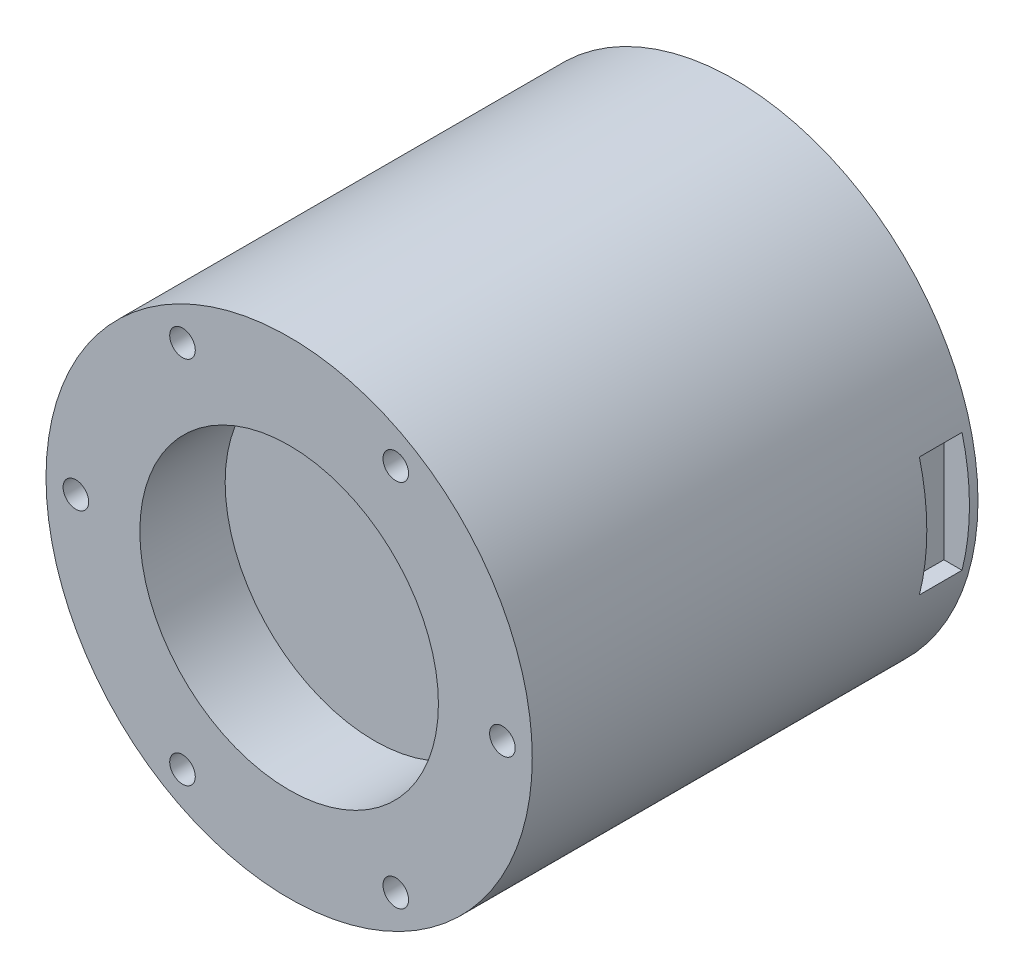
ISO-10303-21;
HEADER;
FILE_DESCRIPTION(('STEP AP214'),'2;1');
FILE_NAME('part.step','',(''),(''),'','','');
FILE_SCHEMA(('AUTOMOTIVE_DESIGN { 1 0 10303 214 1 1 1 1 }'));
ENDSEC;
DATA;
#1=APPLICATION_CONTEXT('core data for automotive mechanical design processes');
#2=APPLICATION_PROTOCOL_DEFINITION('international standard','automotive_design',2000,#1);
#3=PRODUCT_CONTEXT('',#1,'mechanical');
#4=PRODUCT('Part','Part','',(#3));
#5=PRODUCT_RELATED_PRODUCT_CATEGORY('part','',(#4));
#6=PRODUCT_DEFINITION_FORMATION('','',#4);
#7=PRODUCT_DEFINITION_CONTEXT('part definition',#1,'design');
#8=PRODUCT_DEFINITION('design','',#6,#7);
#9=PRODUCT_DEFINITION_SHAPE('','',#8);
#10=(LENGTH_UNIT() NAMED_UNIT(*) SI_UNIT(.MILLI.,.METRE.));
#11=(NAMED_UNIT(*) PLANE_ANGLE_UNIT() SI_UNIT($,.RADIAN.));
#12=(NAMED_UNIT(*) SI_UNIT($,.STERADIAN.) SOLID_ANGLE_UNIT());
#13=UNCERTAINTY_MEASURE_WITH_UNIT(LENGTH_MEASURE(1.E-05),#10,'distance_accuracy_value','');
#14=(GEOMETRIC_REPRESENTATION_CONTEXT(3) GLOBAL_UNCERTAINTY_ASSIGNED_CONTEXT((#13)) GLOBAL_UNIT_ASSIGNED_CONTEXT((#10,
#11,#12)) REPRESENTATION_CONTEXT('',''));
#15=CARTESIAN_POINT('',(0.,0.,0.));
#16=DIRECTION('',(0.,0.,1.));
#17=DIRECTION('',(1.,0.,0.));
#18=AXIS2_PLACEMENT_3D('',#15,#16,#17);
#19=CARTESIAN_POINT('',(0.,0.,52.25));
#20=DIRECTION('',(0.,0.,-1.));
#21=DIRECTION('',(-1.,0.,0.));
#22=AXIS2_PLACEMENT_3D('',#19,#20,#21);
#23=CYLINDRICAL_SURFACE('',#22,28.5);
#24=CARTESIAN_POINT('',(0.,0.,6.));
#25=DIRECTION('',(0.,0.,-1.));
#26=DIRECTION('',(-1.,0.,0.));
#27=AXIS2_PLACEMENT_3D('',#24,#25,#26);
#28=CIRCLE('',#27,28.5);
#29=CARTESIAN_POINT('',(-27.6269795670826,-7.,6.));
#30=VERTEX_POINT('',#29);
#31=CARTESIAN_POINT('',(-27.6269795670826,7.,6.));
#32=VERTEX_POINT('',#31);
#33=EDGE_CURVE('E195',#30,#32,#28,.T.);
#34=ORIENTED_EDGE('',*,*,#33,.F.);
#35=DIRECTION('',(0.,0.,-1.));
#36=VECTOR('',#35,1.);
#37=CARTESIAN_POINT('',(-27.6269795670826,-7.,6.));
#38=LINE('',#37,#36);
#39=CARTESIAN_POINT('',(-27.6269795670826,-7.,1.));
#40=VERTEX_POINT('',#39);
#41=EDGE_CURVE('E208',#30,#40,#38,.T.);
#42=ORIENTED_EDGE('',*,*,#41,.T.);
#43=CARTESIAN_POINT('',(0.,0.,1.));
#44=DIRECTION('',(0.,0.,-1.));
#45=DIRECTION('',(-1.,0.,0.));
#46=AXIS2_PLACEMENT_3D('',#43,#44,#45);
#47=CIRCLE('',#46,28.5);
#48=CARTESIAN_POINT('',(-27.6269795670826,7.,1.));
#49=VERTEX_POINT('',#48);
#50=EDGE_CURVE('E213',#40,#49,#47,.T.);
#51=ORIENTED_EDGE('',*,*,#50,.T.);
#52=DIRECTION('',(0.,0.,-1.));
#53=VECTOR('',#52,1.);
#54=CARTESIAN_POINT('',(-27.6269795670826,7.,6.));
#55=LINE('',#54,#53);
#56=EDGE_CURVE('E230',#32,#49,#55,.T.);
#57=ORIENTED_EDGE('',*,*,#56,.F.);
#58=EDGE_LOOP('',(#34,#42,#51,#57));
#59=FACE_BOUND('',#58,.T.);
#60=CARTESIAN_POINT('',(0.,0.,0.));
#61=DIRECTION('',(0.,0.,1.));
#62=DIRECTION('',(1.,0.,0.));
#63=AXIS2_PLACEMENT_3D('',#60,#61,#62);
#64=CIRCLE('',#63,28.5);
#65=CARTESIAN_POINT('',(28.5,0.,0.));
#66=VERTEX_POINT('',#65);
#67=EDGE_CURVE('E47',#66,#66,#64,.T.);
#68=ORIENTED_EDGE('',*,*,#67,.T.);
#69=EDGE_LOOP('',(#68));
#70=FACE_BOUND('',#69,.T.);
#71=CARTESIAN_POINT('',(0.,0.,52.25));
#72=DIRECTION('',(0.,0.,1.));
#73=DIRECTION('',(1.,0.,0.));
#74=AXIS2_PLACEMENT_3D('',#71,#72,#73);
#75=CIRCLE('',#74,28.5);
#76=CARTESIAN_POINT('',(28.5,0.,52.25));
#77=VERTEX_POINT('',#76);
#78=EDGE_CURVE('E11',#77,#77,#75,.T.);
#79=ORIENTED_EDGE('',*,*,#78,.F.);
#80=EDGE_LOOP('',(#79));
#81=FACE_BOUND('',#80,.T.);
#82=CARTESIAN_POINT('',(0.,0.,6.));
#83=DIRECTION('',(0.,0.,-1.));
#84=DIRECTION('',(-1.,0.,0.));
#85=AXIS2_PLACEMENT_3D('',#82,#83,#84);
#86=CIRCLE('',#85,28.5);
#87=CARTESIAN_POINT('',(27.6269795670826,7.,6.));
#88=VERTEX_POINT('',#87);
#89=CARTESIAN_POINT('',(27.6269795670826,-7.,6.));
#90=VERTEX_POINT('',#89);
#91=EDGE_CURVE('E243',#88,#90,#86,.T.);
#92=ORIENTED_EDGE('',*,*,#91,.F.);
#93=DIRECTION('',(0.,0.,-1.));
#94=VECTOR('',#93,1.);
#95=CARTESIAN_POINT('',(27.6269795670826,7.,6.));
#96=LINE('',#95,#94);
#97=CARTESIAN_POINT('',(27.6269795670826,7.,1.));
#98=VERTEX_POINT('',#97);
#99=EDGE_CURVE('E270',#88,#98,#96,.T.);
#100=ORIENTED_EDGE('',*,*,#99,.T.);
#101=CARTESIAN_POINT('',(0.,0.,1.));
#102=DIRECTION('',(0.,0.,-1.));
#103=DIRECTION('',(-1.,0.,0.));
#104=AXIS2_PLACEMENT_3D('',#101,#102,#103);
#105=CIRCLE('',#104,28.5);
#106=CARTESIAN_POINT('',(27.6269795670826,-7.,1.));
#107=VERTEX_POINT('',#106);
#108=EDGE_CURVE('E257',#98,#107,#105,.T.);
#109=ORIENTED_EDGE('',*,*,#108,.T.);
#110=DIRECTION('',(0.,0.,-1.));
#111=VECTOR('',#110,1.);
#112=CARTESIAN_POINT('',(27.6269795670826,-7.,6.));
#113=LINE('',#112,#111);
#114=EDGE_CURVE('E266',#90,#107,#113,.T.);
#115=ORIENTED_EDGE('',*,*,#114,.F.);
#116=EDGE_LOOP('',(#92,#100,#109,#115));
#117=FACE_BOUND('',#116,.T.);
#118=CARTESIAN_POINT('',(0.,0.,9.));
#119=DIRECTION('',(0.,0.,-1.));
#120=DIRECTION('',(-1.,0.,0.));
#121=AXIS2_PLACEMENT_3D('',#118,#119,#120);
#122=CIRCLE('',#121,28.5);
#123=CARTESIAN_POINT('',(3.99999999999999,-28.2179021190449,9.));
#124=VERTEX_POINT('',#123);
#125=CARTESIAN_POINT('',(-3.99999999999999,-28.2179021190449,9.));
#126=VERTEX_POINT('',#125);
#127=EDGE_CURVE('E148',#124,#126,#122,.T.);
#128=ORIENTED_EDGE('',*,*,#127,.F.);
#129=DIRECTION('',(0.,0.,-1.));
#130=VECTOR('',#129,1.);
#131=CARTESIAN_POINT('',(3.99999999999999,-28.2179021190449,9.));
#132=LINE('',#131,#130);
#133=CARTESIAN_POINT('',(3.99999999999999,-28.2179021190449,1.));
#134=VERTEX_POINT('',#133);
#135=EDGE_CURVE('E143',#124,#134,#132,.T.);
#136=ORIENTED_EDGE('',*,*,#135,.T.);
#137=CARTESIAN_POINT('',(0.,0.,1.));
#138=DIRECTION('',(0.,0.,-1.));
#139=DIRECTION('',(-1.,0.,0.));
#140=AXIS2_PLACEMENT_3D('',#137,#138,#139);
#141=CIRCLE('',#140,28.5);
#142=CARTESIAN_POINT('',(-3.99999999999999,-28.2179021190449,1.));
#143=VERTEX_POINT('',#142);
#144=EDGE_CURVE('E164',#134,#143,#141,.T.);
#145=ORIENTED_EDGE('',*,*,#144,.T.);
#146=DIRECTION('',(0.,0.,-1.));
#147=VECTOR('',#146,1.);
#148=CARTESIAN_POINT('',(-3.99999999999999,-28.2179021190449,9.));
#149=LINE('',#148,#147);
#150=EDGE_CURVE('E187',#126,#143,#149,.T.);
#151=ORIENTED_EDGE('',*,*,#150,.F.);
#152=EDGE_LOOP('',(#128,#136,#145,#151));
#153=FACE_BOUND('',#152,.T.);
#154=ADVANCED_FACE('F44',(#59,#70,#81,#117,#153),#23,.T.);
#155=CARTESIAN_POINT('',(0.,0.,52.25));
#156=DIRECTION('',(0.,0.,1.));
#157=DIRECTION('',(1.,0.,0.));
#158=AXIS2_PLACEMENT_3D('',#155,#156,#157);
#159=PLANE('',#158);
#160=CARTESIAN_POINT('',(0.,0.,52.25));
#161=DIRECTION('',(0.,0.,1.));
#162=DIRECTION('',(1.,0.,0.));
#163=AXIS2_PLACEMENT_3D('',#160,#161,#162);
#164=CIRCLE('',#163,17.5);
#165=CARTESIAN_POINT('',(17.5,0.,52.25));
#166=VERTEX_POINT('',#165);
#167=EDGE_CURVE('E226',#166,#166,#164,.T.);
#168=ORIENTED_EDGE('',*,*,#167,.F.);
#169=EDGE_LOOP('',(#168));
#170=FACE_BOUND('',#169,.T.);
#171=CARTESIAN_POINT('',(12.5000000000003,-21.6506350946108,52.25));
#172=DIRECTION('',(0.,0.,1.));
#173=DIRECTION('',(0.50000000000001,-0.866025403784433,0.));
#174=AXIS2_PLACEMENT_3D('',#171,#172,#173);
#175=CIRCLE('',#174,1.5);
#176=CARTESIAN_POINT('',(13.2500000000003,-22.9496732002875,52.25));
#177=VERTEX_POINT('',#176);
#178=EDGE_CURVE('E281',#177,#177,#175,.T.);
#179=ORIENTED_EDGE('',*,*,#178,.F.);
#180=EDGE_LOOP('',(#179));
#181=FACE_BOUND('',#180,.T.);
#182=CARTESIAN_POINT('',(-12.4999999999998,-21.6506350946111,52.25));
#183=DIRECTION('',(0.,0.,1.));
#184=DIRECTION('',(-0.499999999999992,-0.866025403784443,0.));
#185=AXIS2_PLACEMENT_3D('',#182,#183,#184);
#186=CIRCLE('',#185,1.5);
#187=CARTESIAN_POINT('',(-13.2499999999998,-22.9496732002878,52.25));
#188=VERTEX_POINT('',#187);
#189=EDGE_CURVE('E306',#188,#188,#186,.T.);
#190=ORIENTED_EDGE('',*,*,#189,.F.);
#191=EDGE_LOOP('',(#190));
#192=FACE_BOUND('',#191,.T.);
#193=CARTESIAN_POINT('',(-25.,0.,52.25));
#194=DIRECTION('',(0.,0.,1.));
#195=DIRECTION('',(-1.,0.,0.));
#196=AXIS2_PLACEMENT_3D('',#193,#194,#195);
#197=CIRCLE('',#196,1.5);
#198=CARTESIAN_POINT('',(-26.5,0.,52.25));
#199=VERTEX_POINT('',#198);
#200=EDGE_CURVE('E298',#199,#199,#197,.T.);
#201=ORIENTED_EDGE('',*,*,#200,.F.);
#202=EDGE_LOOP('',(#201));
#203=FACE_BOUND('',#202,.T.);
#204=CARTESIAN_POINT('',(-12.5000000000001,21.6506350946109,52.25));
#205=DIRECTION('',(0.,0.,1.));
#206=DIRECTION('',(-0.500000000000004,0.866025403784436,0.));
#207=AXIS2_PLACEMENT_3D('',#204,#205,#206);
#208=CIRCLE('',#207,1.5);
#209=CARTESIAN_POINT('',(-13.2500000000001,22.9496732002876,52.25));
#210=VERTEX_POINT('',#209);
#211=EDGE_CURVE('E290',#210,#210,#208,.T.);
#212=ORIENTED_EDGE('',*,*,#211,.F.);
#213=EDGE_LOOP('',(#212));
#214=FACE_BOUND('',#213,.T.);
#215=CARTESIAN_POINT('',(12.5,21.650635094611,52.25));
#216=DIRECTION('',(0.,0.,1.));
#217=DIRECTION('',(0.499999999999998,0.86602540378444,0.));
#218=AXIS2_PLACEMENT_3D('',#215,#216,#217);
#219=CIRCLE('',#218,1.5);
#220=CARTESIAN_POINT('',(13.2499999999999,22.9496732002877,52.25));
#221=VERTEX_POINT('',#220);
#222=EDGE_CURVE('E289',#221,#221,#219,.T.);
#223=ORIENTED_EDGE('',*,*,#222,.F.);
#224=EDGE_LOOP('',(#223));
#225=FACE_BOUND('',#224,.T.);
#226=CARTESIAN_POINT('',(25.,0.,52.25));
#227=DIRECTION('',(0.,0.,1.));
#228=DIRECTION('',(1.,0.,0.));
#229=AXIS2_PLACEMENT_3D('',#226,#227,#228);
#230=CIRCLE('',#229,1.5);
#231=CARTESIAN_POINT('',(26.5,0.,52.25));
#232=VERTEX_POINT('',#231);
#233=EDGE_CURVE('E321',#232,#232,#230,.T.);
#234=ORIENTED_EDGE('',*,*,#233,.F.);
#235=EDGE_LOOP('',(#234));
#236=FACE_BOUND('',#235,.T.);
#237=ORIENTED_EDGE('',*,*,#78,.T.);
#238=EDGE_LOOP('',(#237));
#239=FACE_BOUND('',#238,.T.);
#240=ADVANCED_FACE('F335',(#170,#181,#192,#203,#214,#225,#236,#239),#159,.T.);
#241=CARTESIAN_POINT('',(0.,0.,0.));
#242=DIRECTION('',(0.,0.,1.));
#243=DIRECTION('',(1.,0.,0.));
#244=AXIS2_PLACEMENT_3D('',#241,#242,#243);
#245=PLANE('',#244);
#246=CARTESIAN_POINT('',(-13.4350288425444,-13.4350288425444,0.));
#247=DIRECTION('',(0.,0.,-1.));
#248=DIRECTION('',(0.,-1.,0.));
#249=AXIS2_PLACEMENT_3D('',#246,#247,#248);
#250=CIRCLE('',#249,1.5);
#251=CARTESIAN_POINT('',(-13.4350288425444,-14.9350288425444,0.));
#252=VERTEX_POINT('',#251);
#253=EDGE_CURVE('E471',#252,#252,#250,.T.);
#254=ORIENTED_EDGE('',*,*,#253,.F.);
#255=EDGE_LOOP('',(#254));
#256=FACE_BOUND('',#255,.T.);
#257=CARTESIAN_POINT('',(13.4350288425444,-13.4350288425444,0.));
#258=DIRECTION('',(0.,0.,-1.));
#259=DIRECTION('',(1.,0.,0.));
#260=AXIS2_PLACEMENT_3D('',#257,#258,#259);
#261=CIRCLE('',#260,1.5);
#262=CARTESIAN_POINT('',(14.9350288425444,-13.4350288425444,0.));
#263=VERTEX_POINT('',#262);
#264=EDGE_CURVE('E475',#263,#263,#261,.T.);
#265=ORIENTED_EDGE('',*,*,#264,.F.);
#266=EDGE_LOOP('',(#265));
#267=FACE_BOUND('',#266,.T.);
#268=CARTESIAN_POINT('',(13.4350288425443,13.4350288425445,0.));
#269=DIRECTION('',(0.,0.,-1.));
#270=DIRECTION('',(0.,1.,0.));
#271=AXIS2_PLACEMENT_3D('',#268,#269,#270);
#272=CIRCLE('',#271,1.5);
#273=CARTESIAN_POINT('',(13.4350288425443,14.9350288425445,0.));
#274=VERTEX_POINT('',#273);
#275=EDGE_CURVE('E479',#274,#274,#272,.T.);
#276=ORIENTED_EDGE('',*,*,#275,.F.);
#277=EDGE_LOOP('',(#276));
#278=FACE_BOUND('',#277,.T.);
#279=CARTESIAN_POINT('',(-13.4350288425444,13.4350288425444,0.));
#280=DIRECTION('',(0.,0.,-1.));
#281=DIRECTION('',(-1.,0.,0.));
#282=AXIS2_PLACEMENT_3D('',#279,#280,#281);
#283=CIRCLE('',#282,1.5);
#284=CARTESIAN_POINT('',(-14.9350288425444,13.4350288425444,0.));
#285=VERTEX_POINT('',#284);
#286=EDGE_CURVE('E167',#285,#285,#283,.T.);
#287=ORIENTED_EDGE('',*,*,#286,.F.);
#288=EDGE_LOOP('',(#287));
#289=FACE_BOUND('',#288,.T.);
#290=ORIENTED_EDGE('',*,*,#67,.F.);
#291=EDGE_LOOP('',(#290));
#292=FACE_BOUND('',#291,.T.);
#293=ADVANCED_FACE('F338',(#256,#267,#278,#289,#292),#245,.F.);
#294=CARTESIAN_POINT('',(25.,0.,47.25));
#295=DIRECTION('',(0.,0.,1.));
#296=DIRECTION('',(1.,0.,0.));
#297=AXIS2_PLACEMENT_3D('',#294,#295,#296);
#298=CYLINDRICAL_SURFACE('',#297,1.5);
#299=CARTESIAN_POINT('',(25.,0.,47.25));
#300=DIRECTION('',(0.,0.,1.));
#301=DIRECTION('',(1.,0.,0.));
#302=AXIS2_PLACEMENT_3D('',#299,#300,#301);
#303=CIRCLE('',#302,1.5);
#304=CARTESIAN_POINT('',(26.5,0.,47.25));
#305=VERTEX_POINT('',#304);
#306=EDGE_CURVE('E325',#305,#305,#303,.T.);
#307=ORIENTED_EDGE('',*,*,#306,.F.);
#308=EDGE_LOOP('',(#307));
#309=FACE_BOUND('',#308,.T.);
#310=ORIENTED_EDGE('',*,*,#233,.T.);
#311=EDGE_LOOP('',(#310));
#312=FACE_BOUND('',#311,.T.);
#313=ADVANCED_FACE('F333',(#309,#312),#298,.F.);
#314=CARTESIAN_POINT('',(25.,0.,47.25));
#315=DIRECTION('',(0.,0.,1.));
#316=DIRECTION('',(1.,0.,0.));
#317=AXIS2_PLACEMENT_3D('',#314,#315,#316);
#318=PLANE('',#317);
#319=ORIENTED_EDGE('',*,*,#306,.T.);
#320=EDGE_LOOP('',(#319));
#321=FACE_BOUND('',#320,.T.);
#322=ADVANCED_FACE('F457',(#321),#318,.T.);
#323=CARTESIAN_POINT('',(12.5,21.650635094611,47.25));
#324=DIRECTION('',(0.,0.,1.));
#325=DIRECTION('',(1.,0.,0.));
#326=AXIS2_PLACEMENT_3D('',#323,#324,#325);
#327=CYLINDRICAL_SURFACE('',#326,1.5);
#328=CARTESIAN_POINT('',(12.5,21.650635094611,47.25));
#329=DIRECTION('',(0.,0.,1.));
#330=DIRECTION('',(0.499999999999998,0.86602540378444,0.));
#331=AXIS2_PLACEMENT_3D('',#328,#329,#330);
#332=CIRCLE('',#331,1.5);
#333=CARTESIAN_POINT('',(13.2499999999999,22.9496732002877,47.25));
#334=VERTEX_POINT('',#333);
#335=EDGE_CURVE('E317',#334,#334,#332,.T.);
#336=ORIENTED_EDGE('',*,*,#335,.F.);
#337=EDGE_LOOP('',(#336));
#338=FACE_BOUND('',#337,.T.);
#339=ORIENTED_EDGE('',*,*,#222,.T.);
#340=EDGE_LOOP('',(#339));
#341=FACE_BOUND('',#340,.T.);
#342=ADVANCED_FACE('F453',(#338,#341),#327,.F.);
#343=CARTESIAN_POINT('',(12.5,21.650635094611,47.25));
#344=DIRECTION('',(0.,0.,1.));
#345=DIRECTION('',(0.499999999999998,0.86602540378444,0.));
#346=AXIS2_PLACEMENT_3D('',#343,#344,#345);
#347=PLANE('',#346);
#348=ORIENTED_EDGE('',*,*,#335,.T.);
#349=EDGE_LOOP('',(#348));
#350=FACE_BOUND('',#349,.T.);
#351=ADVANCED_FACE('F427',(#350),#347,.T.);
#352=CARTESIAN_POINT('',(-12.5000000000001,21.6506350946109,47.25));
#353=DIRECTION('',(0.,0.,1.));
#354=DIRECTION('',(1.,0.,0.));
#355=AXIS2_PLACEMENT_3D('',#352,#353,#354);
#356=CYLINDRICAL_SURFACE('',#355,1.5);
#357=CARTESIAN_POINT('',(-12.5000000000001,21.6506350946109,47.25));
#358=DIRECTION('',(0.,0.,1.));
#359=DIRECTION('',(-0.500000000000004,0.866025403784436,0.));
#360=AXIS2_PLACEMENT_3D('',#357,#358,#359);
#361=CIRCLE('',#360,1.5);
#362=CARTESIAN_POINT('',(-13.2500000000001,22.9496732002876,47.25));
#363=VERTEX_POINT('',#362);
#364=EDGE_CURVE('E285',#363,#363,#361,.T.);
#365=ORIENTED_EDGE('',*,*,#364,.F.);
#366=EDGE_LOOP('',(#365));
#367=FACE_BOUND('',#366,.T.);
#368=ORIENTED_EDGE('',*,*,#211,.T.);
#369=EDGE_LOOP('',(#368));
#370=FACE_BOUND('',#369,.T.);
#371=ADVANCED_FACE('F423',(#367,#370),#356,.F.);
#372=CARTESIAN_POINT('',(-12.5000000000001,21.6506350946109,47.25));
#373=DIRECTION('',(0.,0.,1.));
#374=DIRECTION('',(-0.500000000000004,0.866025403784436,0.));
#375=AXIS2_PLACEMENT_3D('',#372,#373,#374);
#376=PLANE('',#375);
#377=ORIENTED_EDGE('',*,*,#364,.T.);
#378=EDGE_LOOP('',(#377));
#379=FACE_BOUND('',#378,.T.);
#380=ADVANCED_FACE('F419',(#379),#376,.T.);
#381=CARTESIAN_POINT('',(-25.,0.,47.25));
#382=DIRECTION('',(0.,0.,1.));
#383=DIRECTION('',(1.,0.,0.));
#384=AXIS2_PLACEMENT_3D('',#381,#382,#383);
#385=CYLINDRICAL_SURFACE('',#384,1.5);
#386=CARTESIAN_POINT('',(-25.,0.,47.25));
#387=DIRECTION('',(0.,0.,1.));
#388=DIRECTION('',(-1.,0.,0.));
#389=AXIS2_PLACEMENT_3D('',#386,#387,#388);
#390=CIRCLE('',#389,1.5);
#391=CARTESIAN_POINT('',(-26.5,0.,47.25));
#392=VERTEX_POINT('',#391);
#393=EDGE_CURVE('E294',#392,#392,#390,.T.);
#394=ORIENTED_EDGE('',*,*,#393,.F.);
#395=EDGE_LOOP('',(#394));
#396=FACE_BOUND('',#395,.T.);
#397=ORIENTED_EDGE('',*,*,#200,.T.);
#398=EDGE_LOOP('',(#397));
#399=FACE_BOUND('',#398,.T.);
#400=ADVANCED_FACE('F422',(#396,#399),#385,.F.);
#401=CARTESIAN_POINT('',(-25.,0.,47.25));
#402=DIRECTION('',(0.,0.,1.));
#403=DIRECTION('',(-1.,0.,0.));
#404=AXIS2_PLACEMENT_3D('',#401,#402,#403);
#405=PLANE('',#404);
#406=ORIENTED_EDGE('',*,*,#393,.T.);
#407=EDGE_LOOP('',(#406));
#408=FACE_BOUND('',#407,.T.);
#409=ADVANCED_FACE('F429',(#408),#405,.T.);
#410=CARTESIAN_POINT('',(-12.4999999999998,-21.6506350946111,47.25));
#411=DIRECTION('',(0.,0.,1.));
#412=DIRECTION('',(1.,0.,0.));
#413=AXIS2_PLACEMENT_3D('',#410,#411,#412);
#414=CYLINDRICAL_SURFACE('',#413,1.5);
#415=CARTESIAN_POINT('',(-12.4999999999998,-21.6506350946111,47.25));
#416=DIRECTION('',(0.,0.,1.));
#417=DIRECTION('',(-0.499999999999992,-0.866025403784443,0.));
#418=AXIS2_PLACEMENT_3D('',#415,#416,#417);
#419=CIRCLE('',#418,1.5);
#420=CARTESIAN_POINT('',(-13.2499999999998,-22.9496732002878,47.25));
#421=VERTEX_POINT('',#420);
#422=EDGE_CURVE('E302',#421,#421,#419,.T.);
#423=ORIENTED_EDGE('',*,*,#422,.F.);
#424=EDGE_LOOP('',(#423));
#425=FACE_BOUND('',#424,.T.);
#426=ORIENTED_EDGE('',*,*,#189,.T.);
#427=EDGE_LOOP('',(#426));
#428=FACE_BOUND('',#427,.T.);
#429=ADVANCED_FACE('F432',(#425,#428),#414,.F.);
#430=CARTESIAN_POINT('',(-12.4999999999998,-21.6506350946111,47.25));
#431=DIRECTION('',(0.,0.,1.));
#432=DIRECTION('',(-0.499999999999992,-0.866025403784443,0.));
#433=AXIS2_PLACEMENT_3D('',#430,#431,#432);
#434=PLANE('',#433);
#435=ORIENTED_EDGE('',*,*,#422,.T.);
#436=EDGE_LOOP('',(#435));
#437=FACE_BOUND('',#436,.T.);
#438=ADVANCED_FACE('F437',(#437),#434,.T.);
#439=CARTESIAN_POINT('',(12.5000000000003,-21.6506350946108,47.25));
#440=DIRECTION('',(0.,0.,1.));
#441=DIRECTION('',(1.,0.,0.));
#442=AXIS2_PLACEMENT_3D('',#439,#440,#441);
#443=CYLINDRICAL_SURFACE('',#442,1.5);
#444=CARTESIAN_POINT('',(12.5000000000003,-21.6506350946108,47.25));
#445=DIRECTION('',(0.,0.,1.));
#446=DIRECTION('',(0.50000000000001,-0.866025403784433,0.));
#447=AXIS2_PLACEMENT_3D('',#444,#445,#446);
#448=CIRCLE('',#447,1.5);
#449=CARTESIAN_POINT('',(13.2500000000003,-22.9496732002875,47.25));
#450=VERTEX_POINT('',#449);
#451=EDGE_CURVE('E310',#450,#450,#448,.T.);
#452=ORIENTED_EDGE('',*,*,#451,.F.);
#453=EDGE_LOOP('',(#452));
#454=FACE_BOUND('',#453,.T.);
#455=ORIENTED_EDGE('',*,*,#178,.T.);
#456=EDGE_LOOP('',(#455));
#457=FACE_BOUND('',#456,.T.);
#458=ADVANCED_FACE('F440',(#454,#457),#443,.F.);
#459=CARTESIAN_POINT('',(12.5000000000003,-21.6506350946108,47.25));
#460=DIRECTION('',(0.,0.,1.));
#461=DIRECTION('',(0.50000000000001,-0.866025403784433,0.));
#462=AXIS2_PLACEMENT_3D('',#459,#460,#461);
#463=PLANE('',#462);
#464=ORIENTED_EDGE('',*,*,#451,.T.);
#465=EDGE_LOOP('',(#464));
#466=FACE_BOUND('',#465,.T.);
#467=ADVANCED_FACE('F417',(#466),#463,.T.);
#468=CARTESIAN_POINT('',(0.,0.,42.25));
#469=DIRECTION('',(0.,0.,1.));
#470=DIRECTION('',(1.,0.,0.));
#471=AXIS2_PLACEMENT_3D('',#468,#469,#470);
#472=CYLINDRICAL_SURFACE('',#471,17.5);
#473=CARTESIAN_POINT('',(0.,0.,42.25));
#474=DIRECTION('',(0.,0.,1.));
#475=DIRECTION('',(1.,0.,0.));
#476=AXIS2_PLACEMENT_3D('',#473,#474,#475);
#477=CIRCLE('',#476,17.5);
#478=CARTESIAN_POINT('',(17.5,0.,42.25));
#479=VERTEX_POINT('',#478);
#480=EDGE_CURVE('E277',#479,#479,#477,.T.);
#481=ORIENTED_EDGE('',*,*,#480,.F.);
#482=EDGE_LOOP('',(#481));
#483=FACE_BOUND('',#482,.T.);
#484=ORIENTED_EDGE('',*,*,#167,.T.);
#485=EDGE_LOOP('',(#484));
#486=FACE_BOUND('',#485,.T.);
#487=ADVANCED_FACE('F413',(#483,#486),#472,.F.);
#488=CARTESIAN_POINT('',(0.,0.,42.25));
#489=DIRECTION('',(0.,0.,1.));
#490=DIRECTION('',(1.,0.,0.));
#491=AXIS2_PLACEMENT_3D('',#488,#489,#490);
#492=PLANE('',#491);
#493=ORIENTED_EDGE('',*,*,#480,.T.);
#494=EDGE_LOOP('',(#493));
#495=FACE_BOUND('',#494,.T.);
#496=ADVANCED_FACE('F409',(#495),#492,.T.);
#497=CARTESIAN_POINT('',(25.5,0.,6.));
#498=DIRECTION('',(1.,0.,0.));
#499=DIRECTION('',(0.,0.,-1.));
#500=AXIS2_PLACEMENT_3D('',#497,#498,#499);
#501=PLANE('',#500);
#502=DIRECTION('',(0.,-1.,0.));
#503=VECTOR('',#502,1.);
#504=CARTESIAN_POINT('',(25.5,0.,1.));
#505=LINE('',#504,#503);
#506=CARTESIAN_POINT('',(25.5,7.,1.));
#507=VERTEX_POINT('',#506);
#508=CARTESIAN_POINT('',(25.5,-7.,1.));
#509=VERTEX_POINT('',#508);
#510=EDGE_CURVE('E186',#507,#509,#505,.T.);
#511=ORIENTED_EDGE('',*,*,#510,.F.);
#512=DIRECTION('',(0.,0.,-1.));
#513=VECTOR('',#512,1.);
#514=CARTESIAN_POINT('',(25.5,7.,6.));
#515=LINE('',#514,#513);
#516=CARTESIAN_POINT('',(25.5,7.,6.));
#517=VERTEX_POINT('',#516);
#518=EDGE_CURVE('E250',#517,#507,#515,.T.);
#519=ORIENTED_EDGE('',*,*,#518,.F.);
#520=DIRECTION('',(0.,-1.,0.));
#521=VECTOR('',#520,1.);
#522=CARTESIAN_POINT('',(25.5,0.,6.));
#523=LINE('',#522,#521);
#524=CARTESIAN_POINT('',(25.5,-7.,6.));
#525=VERTEX_POINT('',#524);
#526=EDGE_CURVE('E236',#517,#525,#523,.T.);
#527=ORIENTED_EDGE('',*,*,#526,.T.);
#528=DIRECTION('',(0.,0.,-1.));
#529=VECTOR('',#528,1.);
#530=CARTESIAN_POINT('',(25.5,-7.,6.));
#531=LINE('',#530,#529);
#532=EDGE_CURVE('E214',#525,#509,#531,.T.);
#533=ORIENTED_EDGE('',*,*,#532,.T.);
#534=EDGE_LOOP('',(#511,#519,#527,#533));
#535=FACE_BOUND('',#534,.T.);
#536=ADVANCED_FACE('F402',(#535),#501,.T.);
#537=CARTESIAN_POINT('',(0.,-7.,6.));
#538=DIRECTION('',(0.,-1.,0.));
#539=DIRECTION('',(0.,0.,-1.));
#540=AXIS2_PLACEMENT_3D('',#537,#538,#539);
#541=PLANE('',#540);
#542=DIRECTION('',(-1.,0.,0.));
#543=VECTOR('',#542,1.);
#544=CARTESIAN_POINT('',(0.,-7.,1.));
#545=LINE('',#544,#543);
#546=EDGE_CURVE('E240',#107,#509,#545,.T.);
#547=ORIENTED_EDGE('',*,*,#546,.T.);
#548=ORIENTED_EDGE('',*,*,#532,.F.);
#549=DIRECTION('',(-1.,0.,0.));
#550=VECTOR('',#549,1.);
#551=CARTESIAN_POINT('',(0.,-7.,6.));
#552=LINE('',#551,#550);
#553=EDGE_CURVE('E246',#90,#525,#552,.T.);
#554=ORIENTED_EDGE('',*,*,#553,.F.);
#555=ORIENTED_EDGE('',*,*,#114,.T.);
#556=EDGE_LOOP('',(#547,#548,#554,#555));
#557=FACE_BOUND('',#556,.T.);
#558=ADVANCED_FACE('F399',(#557),#541,.F.);
#559=CARTESIAN_POINT('',(0.,7.,6.));
#560=DIRECTION('',(0.,-1.,0.));
#561=DIRECTION('',(0.,0.,-1.));
#562=AXIS2_PLACEMENT_3D('',#559,#560,#561);
#563=PLANE('',#562);
#564=DIRECTION('',(-1.,0.,0.));
#565=VECTOR('',#564,1.);
#566=CARTESIAN_POINT('',(0.,7.,1.));
#567=LINE('',#566,#565);
#568=EDGE_CURVE('E254',#98,#507,#567,.T.);
#569=ORIENTED_EDGE('',*,*,#568,.F.);
#570=ORIENTED_EDGE('',*,*,#99,.F.);
#571=DIRECTION('',(-1.,0.,0.));
#572=VECTOR('',#571,1.);
#573=CARTESIAN_POINT('',(0.,7.,6.));
#574=LINE('',#573,#572);
#575=EDGE_CURVE('E239',#88,#517,#574,.T.);
#576=ORIENTED_EDGE('',*,*,#575,.T.);
#577=ORIENTED_EDGE('',*,*,#518,.T.);
#578=EDGE_LOOP('',(#569,#570,#576,#577));
#579=FACE_BOUND('',#578,.T.);
#580=ADVANCED_FACE('F394',(#579),#563,.T.);
#581=CARTESIAN_POINT('',(0.,0.,6.));
#582=DIRECTION('',(0.,0.,-1.));
#583=DIRECTION('',(-1.,0.,0.));
#584=AXIS2_PLACEMENT_3D('',#581,#582,#583);
#585=PLANE('',#584);
#586=ORIENTED_EDGE('',*,*,#526,.F.);
#587=ORIENTED_EDGE('',*,*,#575,.F.);
#588=ORIENTED_EDGE('',*,*,#91,.T.);
#589=ORIENTED_EDGE('',*,*,#553,.T.);
#590=EDGE_LOOP('',(#586,#587,#588,#589));
#591=FACE_BOUND('',#590,.T.);
#592=ADVANCED_FACE('F391',(#591),#585,.T.);
#593=CARTESIAN_POINT('',(0.,0.,1.));
#594=DIRECTION('',(0.,0.,-1.));
#595=DIRECTION('',(-1.,0.,0.));
#596=AXIS2_PLACEMENT_3D('',#593,#594,#595);
#597=PLANE('',#596);
#598=ORIENTED_EDGE('',*,*,#510,.T.);
#599=ORIENTED_EDGE('',*,*,#546,.F.);
#600=ORIENTED_EDGE('',*,*,#108,.F.);
#601=ORIENTED_EDGE('',*,*,#568,.T.);
#602=EDGE_LOOP('',(#598,#599,#600,#601));
#603=FACE_BOUND('',#602,.T.);
#604=ADVANCED_FACE('F389',(#603),#597,.F.);
#605=CARTESIAN_POINT('',(0.,-7.,6.));
#606=DIRECTION('',(0.,1.,0.));
#607=DIRECTION('',(0.,0.,1.));
#608=AXIS2_PLACEMENT_3D('',#605,#606,#607);
#609=PLANE('',#608);
#610=DIRECTION('',(1.,0.,0.));
#611=VECTOR('',#610,1.);
#612=CARTESIAN_POINT('',(0.,-7.,1.));
#613=LINE('',#612,#611);
#614=CARTESIAN_POINT('',(-25.5,-7.,1.));
#615=VERTEX_POINT('',#614);
#616=EDGE_CURVE('E209',#40,#615,#613,.T.);
#617=ORIENTED_EDGE('',*,*,#616,.F.);
#618=ORIENTED_EDGE('',*,*,#41,.F.);
#619=DIRECTION('',(1.,0.,0.));
#620=VECTOR('',#619,1.);
#621=CARTESIAN_POINT('',(0.,-7.,6.));
#622=LINE('',#621,#620);
#623=CARTESIAN_POINT('',(-25.5,-7.,6.));
#624=VERTEX_POINT('',#623);
#625=EDGE_CURVE('E192',#30,#624,#622,.T.);
#626=ORIENTED_EDGE('',*,*,#625,.T.);
#627=DIRECTION('',(0.,0.,-1.));
#628=VECTOR('',#627,1.);
#629=CARTESIAN_POINT('',(-25.5,-7.,6.));
#630=LINE('',#629,#628);
#631=EDGE_CURVE('E223',#624,#615,#630,.T.);
#632=ORIENTED_EDGE('',*,*,#631,.T.);
#633=EDGE_LOOP('',(#617,#618,#626,#632));
#634=FACE_BOUND('',#633,.T.);
#635=ADVANCED_FACE('F382',(#634),#609,.T.);
#636=CARTESIAN_POINT('',(-25.5,0.,6.));
#637=DIRECTION('',(1.,0.,0.));
#638=DIRECTION('',(0.,0.,-1.));
#639=AXIS2_PLACEMENT_3D('',#636,#637,#638);
#640=PLANE('',#639);
#641=DIRECTION('',(0.,-1.,0.));
#642=VECTOR('',#641,1.);
#643=CARTESIAN_POINT('',(-25.5,0.,1.));
#644=LINE('',#643,#642);
#645=CARTESIAN_POINT('',(-25.5,7.,1.));
#646=VERTEX_POINT('',#645);
#647=EDGE_CURVE('E196',#646,#615,#644,.T.);
#648=ORIENTED_EDGE('',*,*,#647,.T.);
#649=ORIENTED_EDGE('',*,*,#631,.F.);
#650=DIRECTION('',(0.,-1.,0.));
#651=VECTOR('',#650,1.);
#652=CARTESIAN_POINT('',(-25.5,0.,6.));
#653=LINE('',#652,#651);
#654=CARTESIAN_POINT('',(-25.5,7.,6.));
#655=VERTEX_POINT('',#654);
#656=EDGE_CURVE('E204',#655,#624,#653,.T.);
#657=ORIENTED_EDGE('',*,*,#656,.F.);
#658=DIRECTION('',(0.,0.,-1.));
#659=VECTOR('',#658,1.);
#660=CARTESIAN_POINT('',(-25.5,7.,6.));
#661=LINE('',#660,#659);
#662=EDGE_CURVE('E227',#655,#646,#661,.T.);
#663=ORIENTED_EDGE('',*,*,#662,.T.);
#664=EDGE_LOOP('',(#648,#649,#657,#663));
#665=FACE_BOUND('',#664,.T.);
#666=ADVANCED_FACE('F379',(#665),#640,.F.);
#667=CARTESIAN_POINT('',(0.,7.,6.));
#668=DIRECTION('',(0.,1.,0.));
#669=DIRECTION('',(0.,0.,1.));
#670=AXIS2_PLACEMENT_3D('',#667,#668,#669);
#671=PLANE('',#670);
#672=DIRECTION('',(1.,0.,0.));
#673=VECTOR('',#672,1.);
#674=CARTESIAN_POINT('',(0.,7.,1.));
#675=LINE('',#674,#673);
#676=EDGE_CURVE('E67',#49,#646,#675,.T.);
#677=ORIENTED_EDGE('',*,*,#676,.T.);
#678=ORIENTED_EDGE('',*,*,#662,.F.);
#679=DIRECTION('',(1.,0.,0.));
#680=VECTOR('',#679,1.);
#681=CARTESIAN_POINT('',(0.,7.,6.));
#682=LINE('',#681,#680);
#683=EDGE_CURVE('E200',#32,#655,#682,.T.);
#684=ORIENTED_EDGE('',*,*,#683,.F.);
#685=ORIENTED_EDGE('',*,*,#56,.T.);
#686=EDGE_LOOP('',(#677,#678,#684,#685));
#687=FACE_BOUND('',#686,.T.);
#688=ADVANCED_FACE('F375',(#687),#671,.F.);
#689=CARTESIAN_POINT('',(0.,0.,6.));
#690=DIRECTION('',(0.,0.,-1.));
#691=DIRECTION('',(-1.,0.,0.));
#692=AXIS2_PLACEMENT_3D('',#689,#690,#691);
#693=PLANE('',#692);
#694=ORIENTED_EDGE('',*,*,#625,.F.);
#695=ORIENTED_EDGE('',*,*,#33,.T.);
#696=ORIENTED_EDGE('',*,*,#683,.T.);
#697=ORIENTED_EDGE('',*,*,#656,.T.);
#698=EDGE_LOOP('',(#694,#695,#696,#697));
#699=FACE_BOUND('',#698,.T.);
#700=ADVANCED_FACE('F372',(#699),#693,.T.);
#701=CARTESIAN_POINT('',(0.,0.,1.));
#702=DIRECTION('',(0.,0.,-1.));
#703=DIRECTION('',(-1.,0.,0.));
#704=AXIS2_PLACEMENT_3D('',#701,#702,#703);
#705=PLANE('',#704);
#706=ORIENTED_EDGE('',*,*,#616,.T.);
#707=ORIENTED_EDGE('',*,*,#647,.F.);
#708=ORIENTED_EDGE('',*,*,#676,.F.);
#709=ORIENTED_EDGE('',*,*,#50,.F.);
#710=EDGE_LOOP('',(#706,#707,#708,#709));
#711=FACE_BOUND('',#710,.T.);
#712=ADVANCED_FACE('F371',(#711),#705,.F.);
#713=CARTESIAN_POINT('',(0.,-25.5,9.));
#714=DIRECTION('',(0.,-1.,0.));
#715=DIRECTION('',(0.,0.,-1.));
#716=AXIS2_PLACEMENT_3D('',#713,#714,#715);
#717=PLANE('',#716);
#718=DIRECTION('',(-1.,0.,0.));
#719=VECTOR('',#718,1.);
#720=CARTESIAN_POINT('',(0.,-25.5,1.));
#721=LINE('',#720,#719);
#722=CARTESIAN_POINT('',(3.99999999999999,-25.5,1.));
#723=VERTEX_POINT('',#722);
#724=CARTESIAN_POINT('',(-3.99999999999999,-25.5,1.));
#725=VERTEX_POINT('',#724);
#726=EDGE_CURVE('E154',#723,#725,#721,.T.);
#727=ORIENTED_EDGE('',*,*,#726,.F.);
#728=DIRECTION('',(0.,0.,-1.));
#729=VECTOR('',#728,1.);
#730=CARTESIAN_POINT('',(3.99999999999999,-25.5,9.));
#731=LINE('',#730,#729);
#732=CARTESIAN_POINT('',(3.99999999999999,-25.5,9.));
#733=VERTEX_POINT('',#732);
#734=EDGE_CURVE('E140',#733,#723,#731,.T.);
#735=ORIENTED_EDGE('',*,*,#734,.F.);
#736=DIRECTION('',(-1.,0.,0.));
#737=VECTOR('',#736,1.);
#738=CARTESIAN_POINT('',(0.,-25.5,9.));
#739=LINE('',#738,#737);
#740=CARTESIAN_POINT('',(-3.99999999999999,-25.5,9.));
#741=VERTEX_POINT('',#740);
#742=EDGE_CURVE('E149',#733,#741,#739,.T.);
#743=ORIENTED_EDGE('',*,*,#742,.T.);
#744=DIRECTION('',(0.,0.,-1.));
#745=VECTOR('',#744,1.);
#746=CARTESIAN_POINT('',(-3.99999999999999,-25.5,9.));
#747=LINE('',#746,#745);
#748=EDGE_CURVE('E183',#741,#725,#747,.T.);
#749=ORIENTED_EDGE('',*,*,#748,.T.);
#750=EDGE_LOOP('',(#727,#735,#743,#749));
#751=FACE_BOUND('',#750,.T.);
#752=ADVANCED_FACE('F152',(#751),#717,.T.);
#753=CARTESIAN_POINT('',(-3.99999999999999,0.,9.));
#754=DIRECTION('',(-1.,0.,0.));
#755=DIRECTION('',(0.,0.,1.));
#756=AXIS2_PLACEMENT_3D('',#753,#754,#755);
#757=PLANE('',#756);
#758=DIRECTION('',(0.,1.,0.));
#759=VECTOR('',#758,1.);
#760=CARTESIAN_POINT('',(-3.99999999999999,0.,1.));
#761=LINE('',#760,#759);
#762=EDGE_CURVE('E59',#143,#725,#761,.T.);
#763=ORIENTED_EDGE('',*,*,#762,.T.);
#764=ORIENTED_EDGE('',*,*,#748,.F.);
#765=DIRECTION('',(0.,1.,0.));
#766=VECTOR('',#765,1.);
#767=CARTESIAN_POINT('',(-3.99999999999999,0.,9.));
#768=LINE('',#767,#766);
#769=EDGE_CURVE('E156',#126,#741,#768,.T.);
#770=ORIENTED_EDGE('',*,*,#769,.F.);
#771=ORIENTED_EDGE('',*,*,#150,.T.);
#772=EDGE_LOOP('',(#763,#764,#770,#771));
#773=FACE_BOUND('',#772,.T.);
#774=ADVANCED_FACE('F351',(#773),#757,.F.);
#775=CARTESIAN_POINT('',(3.99999999999999,0.,9.));
#776=DIRECTION('',(-1.,0.,0.));
#777=DIRECTION('',(0.,0.,1.));
#778=AXIS2_PLACEMENT_3D('',#775,#776,#777);
#779=PLANE('',#778);
#780=DIRECTION('',(0.,1.,0.));
#781=VECTOR('',#780,1.);
#782=CARTESIAN_POINT('',(3.99999999999999,0.,1.));
#783=LINE('',#782,#781);
#784=EDGE_CURVE('E176',#134,#723,#783,.T.);
#785=ORIENTED_EDGE('',*,*,#784,.F.);
#786=ORIENTED_EDGE('',*,*,#135,.F.);
#787=DIRECTION('',(0.,1.,0.));
#788=VECTOR('',#787,1.);
#789=CARTESIAN_POINT('',(3.99999999999999,0.,9.));
#790=LINE('',#789,#788);
#791=EDGE_CURVE('E137',#124,#733,#790,.T.);
#792=ORIENTED_EDGE('',*,*,#791,.T.);
#793=ORIENTED_EDGE('',*,*,#734,.T.);
#794=EDGE_LOOP('',(#785,#786,#792,#793));
#795=FACE_BOUND('',#794,.T.);
#796=ADVANCED_FACE('F139',(#795),#779,.T.);
#797=CARTESIAN_POINT('',(0.,0.,9.));
#798=DIRECTION('',(0.,0.,-1.));
#799=DIRECTION('',(-1.,0.,0.));
#800=AXIS2_PLACEMENT_3D('',#797,#798,#799);
#801=PLANE('',#800);
#802=ORIENTED_EDGE('',*,*,#742,.F.);
#803=ORIENTED_EDGE('',*,*,#791,.F.);
#804=ORIENTED_EDGE('',*,*,#127,.T.);
#805=ORIENTED_EDGE('',*,*,#769,.T.);
#806=EDGE_LOOP('',(#802,#803,#804,#805));
#807=FACE_BOUND('',#806,.T.);
#808=ADVANCED_FACE('F159',(#807),#801,.T.);
#809=CARTESIAN_POINT('',(0.,0.,1.));
#810=DIRECTION('',(0.,0.,-1.));
#811=DIRECTION('',(-1.,0.,0.));
#812=AXIS2_PLACEMENT_3D('',#809,#810,#811);
#813=PLANE('',#812);
#814=ORIENTED_EDGE('',*,*,#726,.T.);
#815=ORIENTED_EDGE('',*,*,#762,.F.);
#816=ORIENTED_EDGE('',*,*,#144,.F.);
#817=ORIENTED_EDGE('',*,*,#784,.T.);
#818=EDGE_LOOP('',(#814,#815,#816,#817));
#819=FACE_BOUND('',#818,.T.);
#820=ADVANCED_FACE('F352',(#819),#813,.F.);
#821=CARTESIAN_POINT('',(-13.4350288425444,13.4350288425444,4.));
#822=DIRECTION('',(0.,0.,-1.));
#823=DIRECTION('',(-1.,0.,0.));
#824=AXIS2_PLACEMENT_3D('',#821,#822,#823);
#825=CYLINDRICAL_SURFACE('',#824,1.5);
#826=CARTESIAN_POINT('',(-13.4350288425444,13.4350288425444,4.));
#827=DIRECTION('',(0.,0.,-1.));
#828=DIRECTION('',(-1.,0.,0.));
#829=AXIS2_PLACEMENT_3D('',#826,#827,#828);
#830=CIRCLE('',#829,1.5);
#831=CARTESIAN_POINT('',(-14.9350288425444,13.4350288425444,4.));
#832=VERTEX_POINT('',#831);
#833=EDGE_CURVE('E177',#832,#832,#830,.T.);
#834=ORIENTED_EDGE('',*,*,#833,.F.);
#835=EDGE_LOOP('',(#834));
#836=FACE_BOUND('',#835,.T.);
#837=ORIENTED_EDGE('',*,*,#286,.T.);
#838=EDGE_LOOP('',(#837));
#839=FACE_BOUND('',#838,.T.);
#840=ADVANCED_FACE('F354',(#836,#839),#825,.F.);
#841=CARTESIAN_POINT('',(-13.4350288425444,13.4350288425444,4.));
#842=DIRECTION('',(0.,0.,-1.));
#843=DIRECTION('',(-1.,0.,0.));
#844=AXIS2_PLACEMENT_3D('',#841,#842,#843);
#845=PLANE('',#844);
#846=ORIENTED_EDGE('',*,*,#833,.T.);
#847=EDGE_LOOP('',(#846));
#848=FACE_BOUND('',#847,.T.);
#849=ADVANCED_FACE('F360',(#848),#845,.T.);
#850=CARTESIAN_POINT('',(13.4350288425443,13.4350288425445,4.));
#851=DIRECTION('',(0.,0.,-1.));
#852=DIRECTION('',(-1.,0.,0.));
#853=AXIS2_PLACEMENT_3D('',#850,#851,#852);
#854=CYLINDRICAL_SURFACE('',#853,1.5);
#855=CARTESIAN_POINT('',(13.4350288425443,13.4350288425445,4.));
#856=DIRECTION('',(0.,0.,-1.));
#857=DIRECTION('',(0.,1.,0.));
#858=AXIS2_PLACEMENT_3D('',#855,#856,#857);
#859=CIRCLE('',#858,1.5);
#860=CARTESIAN_POINT('',(13.4350288425443,14.9350288425445,4.));
#861=VERTEX_POINT('',#860);
#862=EDGE_CURVE('E506',#861,#861,#859,.T.);
#863=ORIENTED_EDGE('',*,*,#862,.F.);
#864=EDGE_LOOP('',(#863));
#865=FACE_BOUND('',#864,.T.);
#866=ORIENTED_EDGE('',*,*,#275,.T.);
#867=EDGE_LOOP('',(#866));
#868=FACE_BOUND('',#867,.T.);
#869=ADVANCED_FACE('F512',(#865,#868),#854,.F.);
#870=CARTESIAN_POINT('',(13.4350288425443,13.4350288425445,4.));
#871=DIRECTION('',(0.,0.,-1.));
#872=DIRECTION('',(0.,1.,0.));
#873=AXIS2_PLACEMENT_3D('',#870,#871,#872);
#874=PLANE('',#873);
#875=ORIENTED_EDGE('',*,*,#862,.T.);
#876=EDGE_LOOP('',(#875));
#877=FACE_BOUND('',#876,.T.);
#878=ADVANCED_FACE('F514',(#877),#874,.T.);
#879=CARTESIAN_POINT('',(13.4350288425444,-13.4350288425444,4.));
#880=DIRECTION('',(0.,0.,-1.));
#881=DIRECTION('',(-1.,0.,0.));
#882=AXIS2_PLACEMENT_3D('',#879,#880,#881);
#883=CYLINDRICAL_SURFACE('',#882,1.5);
#884=CARTESIAN_POINT('',(13.4350288425444,-13.4350288425444,4.));
#885=DIRECTION('',(0.,0.,-1.));
#886=DIRECTION('',(1.,0.,0.));
#887=AXIS2_PLACEMENT_3D('',#884,#885,#886);
#888=CIRCLE('',#887,1.5);
#889=CARTESIAN_POINT('',(14.9350288425444,-13.4350288425444,4.));
#890=VERTEX_POINT('',#889);
#891=EDGE_CURVE('E498',#890,#890,#888,.T.);
#892=ORIENTED_EDGE('',*,*,#891,.F.);
#893=EDGE_LOOP('',(#892));
#894=FACE_BOUND('',#893,.T.);
#895=ORIENTED_EDGE('',*,*,#264,.T.);
#896=EDGE_LOOP('',(#895));
#897=FACE_BOUND('',#896,.T.);
#898=ADVANCED_FACE('F521',(#894,#897),#883,.F.);
#899=CARTESIAN_POINT('',(13.4350288425444,-13.4350288425444,4.));
#900=DIRECTION('',(0.,0.,-1.));
#901=DIRECTION('',(1.,0.,0.));
#902=AXIS2_PLACEMENT_3D('',#899,#900,#901);
#903=PLANE('',#902);
#904=ORIENTED_EDGE('',*,*,#891,.T.);
#905=EDGE_LOOP('',(#904));
#906=FACE_BOUND('',#905,.T.);
#907=ADVANCED_FACE('F530',(#906),#903,.T.);
#908=CARTESIAN_POINT('',(-13.4350288425444,-13.4350288425444,4.));
#909=DIRECTION('',(0.,0.,-1.));
#910=DIRECTION('',(-1.,0.,0.));
#911=AXIS2_PLACEMENT_3D('',#908,#909,#910);
#912=CYLINDRICAL_SURFACE('',#911,1.5);
#913=CARTESIAN_POINT('',(-13.4350288425444,-13.4350288425444,4.));
#914=DIRECTION('',(0.,0.,-1.));
#915=DIRECTION('',(0.,-1.,0.));
#916=AXIS2_PLACEMENT_3D('',#913,#914,#915);
#917=CIRCLE('',#916,1.5);
#918=CARTESIAN_POINT('',(-13.4350288425444,-14.9350288425444,4.));
#919=VERTEX_POINT('',#918);
#920=EDGE_CURVE('E489',#919,#919,#917,.T.);
#921=ORIENTED_EDGE('',*,*,#920,.F.);
#922=EDGE_LOOP('',(#921));
#923=FACE_BOUND('',#922,.T.);
#924=ORIENTED_EDGE('',*,*,#253,.T.);
#925=EDGE_LOOP('',(#924));
#926=FACE_BOUND('',#925,.T.);
#927=ADVANCED_FACE('F534',(#923,#926),#912,.F.);
#928=CARTESIAN_POINT('',(-13.4350288425444,-13.4350288425444,4.));
#929=DIRECTION('',(0.,0.,-1.));
#930=DIRECTION('',(0.,-1.,0.));
#931=AXIS2_PLACEMENT_3D('',#928,#929,#930);
#932=PLANE('',#931);
#933=ORIENTED_EDGE('',*,*,#920,.T.);
#934=EDGE_LOOP('',(#933));
#935=FACE_BOUND('',#934,.T.);
#936=ADVANCED_FACE('F538',(#935),#932,.T.);
#937=CLOSED_SHELL('',(#154,#240,#293,#313,#322,#342,#351,#371,#380,#400,#409,#429,#438,#458,
#467,#487,#496,#536,#558,#580,#592,#604,#635,#666,#688,#700,#712,#752,#774,#796,#808,#820,#840,
#849,#869,#878,#898,#907,#927,#936));
#938=MANIFOLD_SOLID_BREP('B2',#937);
#939=ADVANCED_BREP_SHAPE_REPRESENTATION('',(#18,#938),#14);
#940=SHAPE_DEFINITION_REPRESENTATION(#9,#939);
ENDSEC;
END-ISO-10303-21;
